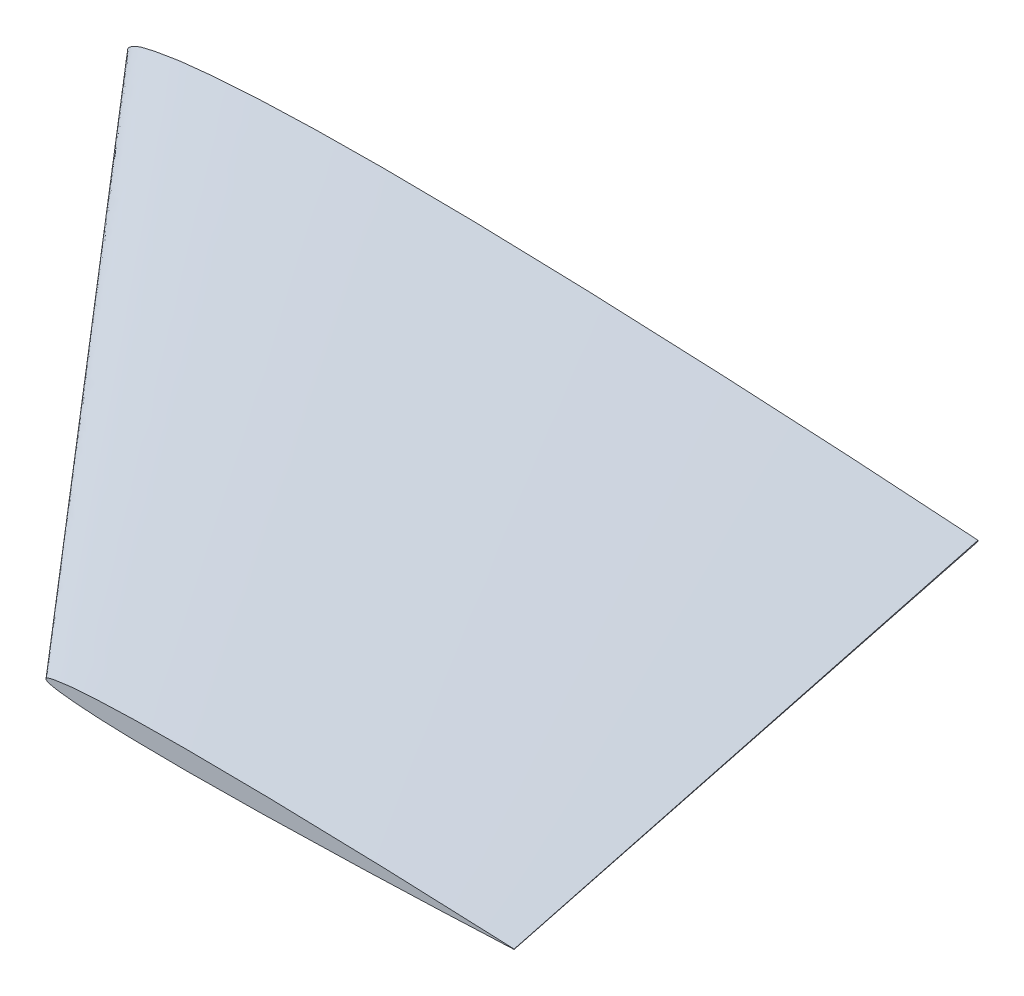
ISO-10303-21;
HEADER;
FILE_DESCRIPTION(('STEP AP214'),'2;1');
FILE_NAME('part.step','',(''),(''),'','','');
FILE_SCHEMA(('AUTOMOTIVE_DESIGN { 1 0 10303 214 1 1 1 1 }'));
ENDSEC;
DATA;
#1=APPLICATION_CONTEXT('core data for automotive mechanical design processes');
#2=APPLICATION_PROTOCOL_DEFINITION('international standard','automotive_design',2000,#1);
#3=PRODUCT_CONTEXT('',#1,'mechanical');
#4=PRODUCT('Part','Part','',(#3));
#5=PRODUCT_RELATED_PRODUCT_CATEGORY('part','',(#4));
#6=PRODUCT_DEFINITION_FORMATION('','',#4);
#7=PRODUCT_DEFINITION_CONTEXT('part definition',#1,'design');
#8=PRODUCT_DEFINITION('design','',#6,#7);
#9=PRODUCT_DEFINITION_SHAPE('','',#8);
#10=(LENGTH_UNIT() NAMED_UNIT(*) SI_UNIT(.MILLI.,.METRE.));
#11=(NAMED_UNIT(*) PLANE_ANGLE_UNIT() SI_UNIT($,.RADIAN.));
#12=(NAMED_UNIT(*) SI_UNIT($,.STERADIAN.) SOLID_ANGLE_UNIT());
#13=UNCERTAINTY_MEASURE_WITH_UNIT(LENGTH_MEASURE(1.E-05),#10,'distance_accuracy_value','');
#14=(GEOMETRIC_REPRESENTATION_CONTEXT(3) GLOBAL_UNCERTAINTY_ASSIGNED_CONTEXT((#13)) GLOBAL_UNIT_ASSIGNED_CONTEXT((#10,
#11,#12)) REPRESENTATION_CONTEXT('',''));
#15=CARTESIAN_POINT('',(0.,0.,0.));
#16=DIRECTION('',(0.,0.,1.));
#17=DIRECTION('',(1.,0.,0.));
#18=AXIS2_PLACEMENT_3D('',#15,#16,#17);
#19=CARTESIAN_POINT('',(55.2654777363227,0.405258247627,918.155140911372));
#20=DIRECTION('',(0.,0.,-1.));
#21=DIRECTION('',(-1.,0.,0.));
#22=AXIS2_PLACEMENT_3D('',#19,#20,#21);
#23=PLANE('',#22);
#24=CARTESIAN_POINT('',(1229.75838698594,0.898545269602727,918.155140911372));
#25=CARTESIAN_POINT('',(1224.34993136014,1.15130631630954,918.155140911372));
#26=CARTESIAN_POINT('',(1214.76939866025,1.59683717142616,918.155140911372));
#27=CARTESIAN_POINT('',(1199.86888525924,2.27524400613824,918.155140911372));
#28=CARTESIAN_POINT('',(1176.43264100726,3.33193433252579,918.155140911372));
#29=CARTESIAN_POINT('',(1139.11425082439,4.96070290179975,918.155140911372));
#30=CARTESIAN_POINT('',(1096.68051596079,6.72959467424628,918.155140911372));
#31=CARTESIAN_POINT('',(1056.90514291557,8.31684053019528,918.155140911372));
#32=CARTESIAN_POINT('',(1010.33634459829,10.118315015342,918.155140911372));
#33=CARTESIAN_POINT('',(960.789254243221,11.931625266129,918.155140911372));
#34=CARTESIAN_POINT('',(894.150492712139,14.2279822769853,918.155140911372));
#35=CARTESIAN_POINT('',(837.568975173821,16.0390334278064,918.155140911372));
#36=CARTESIAN_POINT('',(779.32132193488,17.7480230207474,918.155140911372));
#37=CARTESIAN_POINT('',(734.190270106455,18.9770111749645,918.155140911372));
#38=CARTESIAN_POINT('',(688.493528764218,20.1194114682806,918.155140911372));
#39=CARTESIAN_POINT('',(627.251826184914,21.4968016750588,918.155140911372));
#40=CARTESIAN_POINT('',(566.196309532538,22.6070292220859,918.155140911372));
#41=CARTESIAN_POINT('',(505.704852635155,23.3778785425328,918.155140911372));
#42=CARTESIAN_POINT('',(447.458734920324,23.8802464006073,918.155140911372));
#43=CARTESIAN_POINT('',(390.875359625353,23.9812870523486,918.155140911372));
#44=CARTESIAN_POINT('',(336.305763097462,23.5896145041729,918.155140911372));
#45=CARTESIAN_POINT('',(298.043986056536,23.0594518914088,918.155140911372));
#46=CARTESIAN_POINT('',(261.905755466201,22.2865017846476,918.155140911372));
#47=CARTESIAN_POINT('',(228.113855391048,21.2698584747062,918.155140911372));
#48=CARTESIAN_POINT('',(196.876279734094,20.0229760334591,918.155140911372));
#49=CARTESIAN_POINT('',(168.384950422636,18.5530382160247,918.155140911372));
#50=CARTESIAN_POINT('',(142.816057725576,16.8789210677314,918.155140911372));
#51=CARTESIAN_POINT('',(120.324058775331,15.0121491141771,918.155140911372));
#52=CARTESIAN_POINT('',(101.051103607294,13.0004806498629,918.155140911372));
#53=CARTESIAN_POINT('',(85.0971329000786,10.7977761238851,918.155140911372));
#54=CARTESIAN_POINT('',(72.5876254377587,8.62490914223578,918.155140911372));
#55=CARTESIAN_POINT('',(63.4611062545765,6.06034795633361,918.155140911372));
#56=CARTESIAN_POINT('',(57.7960656285395,4.14958959547926,918.155140911372));
#57=CARTESIAN_POINT('',(54.378337601271,0.405258247626857,918.155140911372));
#58=CARTESIAN_POINT('',(57.7960656285401,-3.33907310022474,918.155140911372));
#59=CARTESIAN_POINT('',(63.4611062545775,-5.24983146107839,918.155140911372));
#60=CARTESIAN_POINT('',(72.5876254377602,-7.81439264697905,918.155140911372));
#61=CARTESIAN_POINT('',(85.0971329000802,-9.98725962862657,918.155140911372));
#62=CARTESIAN_POINT('',(101.051103607296,-12.1899641546018,918.155140911372));
#63=CARTESIAN_POINT('',(120.324058775333,-14.2016326189131,918.155140911372));
#64=CARTESIAN_POINT('',(142.816057725579,-16.0684045724638,918.155140911372));
#65=CARTESIAN_POINT('',(168.384950422639,-17.7425217207532,918.155140911372));
#66=CARTESIAN_POINT('',(196.876279734098,-19.2124595381831,918.155140911372));
#67=CARTESIAN_POINT('',(228.113855391051,-20.4593419794254,918.155140911372));
#68=CARTESIAN_POINT('',(261.905755466204,-21.4759852893616,918.155140911372));
#69=CARTESIAN_POINT('',(298.04398605654,-22.2489353961172,918.155140911372));
#70=CARTESIAN_POINT('',(336.305763097466,-22.7790980088754,918.155140911372));
#71=CARTESIAN_POINT('',(390.875359625356,-23.1707705570427,918.155140911372));
#72=CARTESIAN_POINT('',(447.458734920328,-23.0697299052926,918.155140911372));
#73=CARTESIAN_POINT('',(505.704852635158,-22.5673620472091,918.155140911372));
#74=CARTESIAN_POINT('',(566.196309532541,-21.7965127267529,918.155140911372));
#75=CARTESIAN_POINT('',(627.251826184917,-20.6862851797162,918.155140911372));
#76=CARTESIAN_POINT('',(688.493528764221,-19.3088949729285,918.155140911372));
#77=CARTESIAN_POINT('',(734.190270106458,-18.1664946796054,918.155140911372));
#78=CARTESIAN_POINT('',(779.321321934882,-16.9375065253813,918.155140911372));
#79=CARTESIAN_POINT('',(863.764331051802,-14.4599436408096,918.155140911372));
#80=CARTESIAN_POINT('',(945.19610019987,-11.7216102378138,918.155140911372));
#81=CARTESIAN_POINT('',(1023.11508713161,-8.81346369795726,918.155140911372));
#82=CARTESIAN_POINT('',(1066.42142830851,-7.13819460159755,918.155140911372));
#83=CARTESIAN_POINT('',(1106.19593886475,-5.52895444030219,918.155140911372));
#84=CARTESIAN_POINT('',(1148.62859838091,-3.73493081305462,918.155140911372));
#85=CARTESIAN_POINT('',(1176.43264100726,-2.5214178370983,918.155140911372));
#86=CARTESIAN_POINT('',(1199.86888525924,-1.46472751070709,918.155140911372));
#87=CARTESIAN_POINT('',(1214.16606761279,-0.813789790322492,918.155140911372));
#88=CARTESIAN_POINT('',(1223.74663382607,-0.368984582325911,918.155140911372));
#89=CARTESIAN_POINT('',(1229.15508945187,-0.116223535618259,918.155140911372));
#90=CARTESIAN_POINT('',(1229.75838698594,-0.0880287741669511,918.155140911372));
#91=B_SPLINE_CURVE_WITH_KNOTS('',3,(#24,#25,#26,#27,#28,#29,#30,#31,#32,#33,#34,#35,#36,#37,#38,
#39,#40,#41,#42,#43,#44,#45,#46,#47,#48,#49,#50,#51,#52,#53,#54,#55,#56,#57,#58,#59,#60,#61,#62,
#63,#64,#65,#66,#67,#68,#69,#70,#71,#72,#73,#74,#75,#76,#77,#78,#79,#80,#81,#82,#83,#84,#85,#86,
#87,#88,#89,#90),.UNSPECIFIED.,.F.,.F.,(4,1,1,1,1,1,1,1,1,1,1,1,1,1,1,1,1,1,1,1,1,1,1,1,1,1,1,1,
1,1,1,1,1,1,1,1,1,1,1,1,1,1,1,1,1,1,1,1,1,1,1,1,1,1,1,1,1,1,1,1,1,1,1,1,4),(0.,
0.00689462452443807,0.0122129980770875,0.0189939135438821,0.036768569667984,0.0597793156848744,
0.0730757688774927,0.0874586832594532,0.119124190161914,0.136211022881369,0.17236657212777,
0.191211673140014,0.21041524145613,0.229857547050433,0.249419863694867,0.288419829497961,
0.307617824573225,0.326455527077329,0.362592745666242,0.379669911028139,0.39594558697329,
0.41131942363183,0.425698226139487,0.438994919331845,0.451128209388672,0.462026116437248,
0.471623197242087,0.479864509226328,0.48670418473288,0.492110985593961,0.496072413913456,
0.498623118658728,0.5,0.501376881341272,0.503927586086544,0.507889014406039,0.513295815267119,
0.520135490773672,0.528376802757913,0.537973883562752,0.548871790611328,0.561005080668155,
0.574301773860513,0.58868057636817,0.60405441302671,0.620330088971861,0.637407254333758,
0.673544472922671,0.692382175426775,0.711580170502039,0.750580136305133,0.770142452949567,
0.78958475854387,0.808788326859985,0.82763342787223,0.897160380173092,0.912541316740547,
0.926924231122507,0.95234774755356,0.963231430332016,0.981006086456118,0.987787001922912,
0.993105375475562,0.999230924636945,1.),.UNSPECIFIED.);
#92=CARTESIAN_POINT('',(1229.75838698594,0.898545269602727,918.155140911372));
#93=VERTEX_POINT('',#92);
#94=CARTESIAN_POINT('',(1229.75838698594,-0.0880287741669511,918.155140911372));
#95=VERTEX_POINT('',#94);
#96=EDGE_CURVE('E70',#93,#95,#91,.T.);
#97=ORIENTED_EDGE('',*,*,#96,.T.);
#98=DIRECTION('',(0.,1.,0.));
#99=VECTOR('',#98,1.);
#100=CARTESIAN_POINT('',(1229.75838698594,0.898545269602727,918.155140911372));
#101=LINE('',#100,#99);
#102=EDGE_CURVE('E12',#95,#93,#101,.T.);
#103=ORIENTED_EDGE('',*,*,#102,.T.);
#104=EDGE_LOOP('',(#97,#103));
#105=FACE_BOUND('',#104,.T.);
#106=ADVANCED_FACE('F60',(#105),#23,.F.);
#107=CARTESIAN_POINT('',(-1209.97458284238,-0.246171439116011,-551.844859088628));
#108=DIRECTION('',(0.,0.,-1.));
#109=DIRECTION('',(-1.,0.,0.));
#110=AXIS2_PLACEMENT_3D('',#107,#108,#109);
#111=PLANE('',#110);
#112=CARTESIAN_POINT('',(923.625417157617,1.09799656088432,-551.844859088628));
#113=CARTESIAN_POINT('',(888.06732232774,3.54460735318126,-551.844859088628));
#114=CARTESIAN_POINT('',(816.960024152842,8.43721715013834,-551.844859088628));
#115=CARTESIAN_POINT('',(674.732135806498,17.5357949323186,-551.844859088628));
#116=CARTESIAN_POINT('',(496.945434871093,27.9861196052224,-551.844859088628));
#117=CARTESIAN_POINT('',(283.58112304172,39.077632186636,-551.844859088628));
#118=CARTESIAN_POINT('',(70.2224980431571,48.74093153832,-551.844859088628));
#119=CARTESIAN_POINT('',(-143.138146072975,56.605070136845,-551.844859088628));
#120=CARTESIAN_POINT('',(-356.503590152205,62.2133345643726,-551.844859088628));
#121=CARTESIAN_POINT('',(-534.330553633457,64.1720758987067,-551.844859088628));
#122=CARTESIAN_POINT('',(-676.585573721354,63.397012287764,-551.844859088628));
#123=CARTESIAN_POINT('',(-783.278142447043,61.2911594275953,-551.844859088628));
#124=CARTESIAN_POINT('',(-890.02642619169,57.2331308576976,-551.844859088628));
#125=CARTESIAN_POINT('',(-978.872375952373,51.5926695171229,-551.844859088628));
#126=CARTESIAN_POINT('',(-1050.15080477563,44.7660884906984,-551.844859088628));
#127=CARTESIAN_POINT('',(-1103.12751739306,38.3296888009779,-551.844859088628));
#128=CARTESIAN_POINT('',(-1149.30191136656,29.46520616275,-551.844859088628));
#129=CARTESIAN_POINT('',(-1183.15092110764,21.6242292641085,-551.844859088628));
#130=CARTESIAN_POINT('',(-1224.63647939,-0.246171439115794,-551.844859088628));
#131=CARTESIAN_POINT('',(-1183.15092110764,-22.1165721423397,-551.844859088628));
#132=CARTESIAN_POINT('',(-1149.30191136656,-29.9575490409815,-551.844859088628));
#133=CARTESIAN_POINT('',(-1103.12751739306,-38.8220316792093,-551.844859088628));
#134=CARTESIAN_POINT('',(-1050.15080477563,-45.2584313689298,-551.844859088628));
#135=CARTESIAN_POINT('',(-978.872375952373,-52.0850123953543,-551.844859088628));
#136=CARTESIAN_POINT('',(-890.02642619169,-57.7254737359289,-551.844859088628));
#137=CARTESIAN_POINT('',(-783.278142447043,-61.7835023058266,-551.844859088628));
#138=CARTESIAN_POINT('',(-676.585573721354,-63.8893551659955,-551.844859088628));
#139=CARTESIAN_POINT('',(-534.330553633457,-64.6644187769381,-551.844859088628));
#140=CARTESIAN_POINT('',(-356.503590152204,-62.7056774426039,-551.844859088628));
#141=CARTESIAN_POINT('',(-143.138146072975,-57.0974130150764,-551.844859088628));
#142=CARTESIAN_POINT('',(70.2224980431576,-49.2332744165514,-551.844859088628));
#143=CARTESIAN_POINT('',(283.581123041721,-39.5699750648674,-551.844859088628));
#144=CARTESIAN_POINT('',(496.945434871091,-28.4784624834538,-551.844859088628));
#145=CARTESIAN_POINT('',(674.732135806499,-18.0281378105499,-551.844859088628));
#146=CARTESIAN_POINT('',(816.960024152842,-8.9295600283697,-551.844859088628));
#147=CARTESIAN_POINT('',(888.067322327741,-4.03695023141262,-551.844859088628));
#148=CARTESIAN_POINT('',(923.625417157617,-1.59033943911568,-551.844859088628));
#149=B_SPLINE_CURVE_WITH_KNOTS('',3,(#112,#113,#114,#115,#116,#117,#118,#119,#120,#121,#122,
#123,#124,#125,#126,#127,#128,#129,#130,#131,#132,#133,#134,#135,#136,#137,#138,#139,#140,#141,
#142,#143,#144,#145,#146,#147,#148),.UNSPECIFIED.,.F.,.F.,(4,1,1,1,1,1,1,1,1,1,1,1,1,1,1,1,1,1,
1,1,1,1,1,1,1,1,1,1,1,1,1,1,1,1,4),(0.,0.0249245577594703,0.0498428830048284,0.0996630479535091,
0.149464505803989,0.199249098798805,0.249016479528594,0.298766909273868,0.348503608962617,
0.373371187827416,0.398243492902326,0.423129722742987,0.448051612806012,0.46054281715137,
0.473079727808674,0.485731111482558,0.492200581361296,0.5,0.507799418638703,0.514268888517442,
0.526920272191325,0.53945718284863,0.551948387193988,0.576870277257013,0.601756507097674,
0.626628812172583,0.651496391037383,0.701233090726132,0.750983520471406,0.800750901201195,
0.850535494196011,0.900336952046491,0.950157116995171,0.97507544224053,1.),.UNSPECIFIED.);
#150=CARTESIAN_POINT('',(923.625417157617,1.09799656088432,-551.844859088628));
#151=VERTEX_POINT('',#150);
#152=CARTESIAN_POINT('',(923.625417157617,-1.59033943911568,-551.844859088628));
#153=VERTEX_POINT('',#152);
#154=EDGE_CURVE('E64',#151,#153,#149,.T.);
#155=ORIENTED_EDGE('',*,*,#154,.F.);
#156=DIRECTION('',(0.,1.,0.));
#157=VECTOR('',#156,1.);
#158=CARTESIAN_POINT('',(923.625417157617,1.09799656088432,-551.844859088628));
#159=LINE('',#158,#157);
#160=EDGE_CURVE('E97',#153,#151,#159,.T.);
#161=ORIENTED_EDGE('',*,*,#160,.F.);
#162=EDGE_LOOP('',(#155,#161));
#163=FACE_BOUND('',#162,.T.);
#164=ADVANCED_FACE('F105',(#163),#111,.T.);
#165=CARTESIAN_POINT('',(923.625417157617,1.09799656088432,-551.844859088628));
#166=CARTESIAN_POINT('',(1229.75838698594,0.898545269602727,918.155140911372));
#167=CARTESIAN_POINT('',(913.789346442854,1.77477738616962,-551.844859088628));
#168=CARTESIAN_POINT('',(1224.34993136014,1.15130631630954,918.155140911372));
#169=CARTESIAN_POINT('',(896.365930229293,2.97361321668103,-551.844859088628));
#170=CARTESIAN_POINT('',(1214.76939866025,1.59683717142616,918.155140911372));
#171=CARTESIAN_POINT('',(869.268073566488,4.82922714437675,-551.844859088628));
#172=CARTESIAN_POINT('',(1199.86888525924,2.27524400613824,918.155140911372));
#173=CARTESIAN_POINT('',(843.544505607081,6.57593733831357,-551.844859088628));
#174=CARTESIAN_POINT('',(1185.7243215897,2.91299224940928,918.155140911372));
#175=CARTESIAN_POINT('',(808.508526054949,8.9220676243081,-551.844859088628));
#176=CARTESIAN_POINT('',(1166.4597238693,3.7672042865263,918.155140911372));
#177=CARTESIAN_POINT('',(764.488058577073,11.7939446226889,-551.844859088628));
#178=CARTESIAN_POINT('',(1142.25671778818,4.81665356793921,918.155140911372));
#179=CARTESIAN_POINT('',(714.744728454747,14.9351792272061,-551.844859088628));
#180=CARTESIAN_POINT('',(1114.90951556066,5.96970098315827,918.155140911372));
#181=CARTESIAN_POINT('',(662.923388568366,18.1247945247199,-551.844859088628));
#182=CARTESIAN_POINT('',(1086.42140124516,7.13898712166777,918.155140911372));
#183=CARTESIAN_POINT('',(609.22903797123,21.3433431137826,-551.844859088628));
#184=CARTESIAN_POINT('',(1056.90514291557,8.31684053019528,918.155140911372));
#185=CARTESIAN_POINT('',(552.2909593488,24.6477615154637,-551.844859088628));
#186=CARTESIAN_POINT('',(1025.60778993394,9.52755209859143,918.155140911372));
#187=CARTESIAN_POINT('',(486.545356812237,28.3435433901783,-551.844859088628));
#188=CARTESIAN_POINT('',(989.471261540352,10.8819293612369,918.155140911372));
#189=CARTESIAN_POINT('',(416.930956707071,32.1064245543777,-551.844859088628));
#190=CARTESIAN_POINT('',(951.210830385022,12.261695637702,918.155140911372));
#191=CARTESIAN_POINT('',(345.809220326377,35.7744876363282,-551.844859088628));
#192=CARTESIAN_POINT('',(912.124857128222,13.6085896473173,918.155140911372));
#193=CARTESIAN_POINT('',(269.765620598856,39.5407174313364,-551.844859088628));
#194=CARTESIAN_POINT('',(870.336357016186,14.9902208971983,918.155140911372));
#195=CARTESIAN_POINT('',(191.201450692905,43.2408954505334,-551.844859088628));
#196=CARTESIAN_POINT('',(827.165465881324,16.3442730060948,918.155140911372));
#197=CARTESIAN_POINT('',(120.077937044886,46.3671733031927,-551.844859088628));
#198=CARTESIAN_POINT('',(788.086343897414,17.4908567576806,918.155140911372));
#199=CARTESIAN_POINT('',(65.7155603587633,48.637035099175,-551.844859088628));
#200=CARTESIAN_POINT('',(758.218240866912,18.3226924689272,918.155140911372));
#201=CARTESIAN_POINT('',(10.4961817065889,50.8528555495445,-551.844859088628));
#202=CARTESIAN_POINT('',(727.88043367474,19.1347545671329,918.155140911372));
#203=CARTESIAN_POINT('',(-60.6218662603444,53.5117378369311,-551.844859088628));
#204=CARTESIAN_POINT('',(688.810208285296,20.1114946066589,918.155140911372));
#205=CARTESIAN_POINT('',(-116.36732020811,55.3850943101544,-551.844859088628));
#206=CARTESIAN_POINT('',(658.187548044737,20.8010248018708,918.155140911372));
#207=CARTESIAN_POINT('',(-200.070255091131,58.0239917181841,-551.844859088628));
#208=CARTESIAN_POINT('',(612.208689017363,21.7703446109447,918.155140911372));
#209=CARTESIAN_POINT('',(-271.188090215329,59.9673465033982,-551.844859088628));
#210=CARTESIAN_POINT('',(573.145837281976,22.4806596887613,918.155140911372));
#211=CARTESIAN_POINT('',(-354.394992056531,61.6510999032166,-551.844859088628));
#212=CARTESIAN_POINT('',(527.44705302474,23.1008152801326,918.155140911372));
#213=CARTESIAN_POINT('',(-408.778816513714,62.5913472272243,-551.844859088628));
#214=CARTESIAN_POINT('',(497.579552218694,23.447958574071,918.155140911372));
#215=CARTESIAN_POINT('',(-479.898172972523,63.4951728859228,-551.844859088628));
#216=CARTESIAN_POINT('',(458.522578130665,23.7848216850432,918.155140911372));
#217=CARTESIAN_POINT('',(-558.512954247965,63.8807463623216,-551.844859088628));
#218=CARTESIAN_POINT('',(415.350633737413,23.9375816771401,918.155140911372));
#219=CARTESIAN_POINT('',(-625.603748861349,63.6747821495519,-551.844859088628));
#220=CARTESIAN_POINT('',(378.507697931058,23.8665518363043,918.155140911372));
#221=CARTESIAN_POINT('',(-670.169653906873,63.2516192473587,-551.844859088628));
#222=CARTESIAN_POINT('',(354.033130941068,23.7168524494306,918.155140911372));
#223=CARTESIAN_POINT('',(-717.858278201574,62.564855246702,-551.844859088628));
#224=CARTESIAN_POINT('',(327.842178711294,23.4723414353679,918.155140911372));
#225=CARTESIAN_POINT('',(-753.41753689877,61.805878789219,-551.844859088628));
#226=CARTESIAN_POINT('',(308.311633412431,23.2017224070547,918.155140911372));
#227=CARTESIAN_POINT('',(-798.662464187911,60.5377224375339,-551.844859088628));
#228=CARTESIAN_POINT('',(283.461301831965,22.7475470985034,918.155140911372));
#229=CARTESIAN_POINT('',(-837.521393532175,59.2291060164683,-551.844859088628));
#230=CARTESIAN_POINT('',(262.118572647569,22.2767211279415,918.155140911372));
#231=CARTESIAN_POINT('',(-876.741529253904,57.4763437707698,-551.844859088628));
#232=CARTESIAN_POINT('',(240.56736183194,21.6445273740663,918.155140911372));
#233=CARTESIAN_POINT('',(-916.250771619602,55.4202728230343,-551.844859088628));
#234=CARTESIAN_POINT('',(218.846425978117,20.8999387620697,918.155140911372));
#235=CARTESIAN_POINT('',(-951.806552265554,53.260783138629,-551.844859088628));
#236=CARTESIAN_POINT('',(199.290455818334,20.1193405465882,918.155140911372));
#237=CARTESIAN_POINT('',(-988.082115093888,50.4609469450632,-551.844859088628));
#238=CARTESIAN_POINT('',(179.344909331845,19.1184894767244,918.155140911372));
#239=CARTESIAN_POINT('',(-1018.8260883676,47.7661646458485,-551.844859088628));
#240=CARTESIAN_POINT('',(162.450696158399,18.1546953146969,918.155140911372));
#241=CARTESIAN_POINT('',(-1038.73154448351,45.7976272294449,-551.844859088628));
#242=CARTESIAN_POINT('',(151.499110210343,17.4474418572903,918.155140911372));
#243=CARTESIAN_POINT('',(-1067.73733768746,42.6058037198232,-551.844859088628));
#244=CARTESIAN_POINT('',(135.447212428448,16.2673278624681,918.155140911372));
#245=CARTESIAN_POINT('',(-1085.41183064038,40.414974206502,-551.844859088628));
#246=CARTESIAN_POINT('',(125.634530108997,15.452903133763,918.155140911372));
#247=CARTESIAN_POINT('',(-1110.90479321826,36.51099551613,-551.844859088628));
#248=CARTESIAN_POINT('',(111.691464284776,14.1110979805834,918.155140911372));
#249=CARTESIAN_POINT('',(-1131.30914816735,32.9194266357823,-551.844859088628));
#250=CARTESIAN_POINT('',(100.676626719884,12.92564924701,918.155140911372));
#251=CARTESIAN_POINT('',(-1150.20854097809,29.0500249577539,-551.844859088628));
#252=CARTESIAN_POINT('',(90.0651813268249,11.4836958209748,918.155140911372));
#253=CARTESIAN_POINT('',(-1166.3151929633,25.5226628781397,-551.844859088628));
#254=CARTESIAN_POINT('',(80.5692000105757,10.0112866557458,918.155140911372));
#255=CARTESIAN_POINT('',(-1174.72578772203,23.3341592986884,-551.844859088628));
#256=CARTESIAN_POINT('',(75.5759647165899,9.14397544188799,918.155140911372));
#257=CARTESIAN_POINT('',(-1189.11263831586,17.6743977131648,-551.844859088628));
#258=CARTESIAN_POINT('',(68.3789462404663,7.44226600122543,918.155140911372));
#259=CARTESIAN_POINT('',(-1200.23879135985,12.4749934791344,-551.844859088628));
#260=CARTESIAN_POINT('',(63.3967682225039,6.03864741774638,918.155140911372));
#261=CARTESIAN_POINT('',(-1208.67115223669,5.01072603574235,-551.844859088628));
#262=CARTESIAN_POINT('',(57.7960656285395,4.14958959547926,918.155140911372));
#263=CARTESIAN_POINT('',(-1210.43152235716,-0.246171439116067,-551.844859088628));
#264=CARTESIAN_POINT('',(54.378337601271,0.405258247626857,918.155140911372));
#265=CARTESIAN_POINT('',(-1208.67115223669,-5.50306891397447,-551.844859088628));
#266=CARTESIAN_POINT('',(57.7960656285401,-3.33907310022474,918.155140911372));
#267=CARTESIAN_POINT('',(-1200.23879135985,-12.9673363573664,-551.844859088628));
#268=CARTESIAN_POINT('',(63.3967682225047,-5.2281309224911,918.155140911372));
#269=CARTESIAN_POINT('',(-1189.11263831586,-18.1667405913966,-551.844859088628));
#270=CARTESIAN_POINT('',(68.3789462404674,-6.63174950596933,918.155140911372));
#271=CARTESIAN_POINT('',(-1174.72578772203,-23.82650217692,-551.844859088628));
#272=CARTESIAN_POINT('',(75.575964716591,-8.33345894663077,918.155140911372));
#273=CARTESIAN_POINT('',(-1166.3151929633,-26.0150057563712,-551.844859088628));
#274=CARTESIAN_POINT('',(80.5692000105769,-9.20077016048784,918.155140911372));
#275=CARTESIAN_POINT('',(-1150.20854097809,-29.5423678359855,-551.844859088628));
#276=CARTESIAN_POINT('',(90.0651813268264,-10.6731793257154,918.155140911372));
#277=CARTESIAN_POINT('',(-1131.30914816735,-33.4117695140138,-551.844859088628));
#278=CARTESIAN_POINT('',(100.676626719886,-12.1151327517489,918.155140911372));
#279=CARTESIAN_POINT('',(-1110.90479321826,-37.0033383943615,-551.844859088628));
#280=CARTESIAN_POINT('',(111.691464284779,-13.3005814853206,918.155140911372));
#281=CARTESIAN_POINT('',(-1085.41183064037,-40.9073170847335,-551.844859088628));
#282=CARTESIAN_POINT('',(125.634530108999,-14.6423866384981,918.155140911372));
#283=CARTESIAN_POINT('',(-1067.73733768746,-43.0981465980547,-551.844859088628));
#284=CARTESIAN_POINT('',(135.44721242845,-15.4568113672016,918.155140911372));
#285=CARTESIAN_POINT('',(-1038.73154448351,-46.2899701076764,-551.844859088628));
#286=CARTESIAN_POINT('',(151.499110210345,-16.6369253620213,918.155140911372));
#287=CARTESIAN_POINT('',(-1018.8260883676,-48.2585075240799,-551.844859088628));
#288=CARTESIAN_POINT('',(162.450696158401,-17.3441788194263,918.155140911372));
#289=CARTESIAN_POINT('',(-988.082115093887,-50.9532898232946,-551.844859088628));
#290=CARTESIAN_POINT('',(179.344909331848,-18.3079729814511,918.155140911372));
#291=CARTESIAN_POINT('',(-951.806552265553,-53.7531260168604,-551.844859088628));
#292=CARTESIAN_POINT('',(199.290455818337,-19.3088240513119,918.155140911372));
#293=CARTESIAN_POINT('',(-916.250771619601,-55.9126157012658,-551.844859088628));
#294=CARTESIAN_POINT('',(218.846425978121,-20.0894222667904,918.155140911372));
#295=CARTESIAN_POINT('',(-876.741529253903,-57.9686866490012,-551.844859088628));
#296=CARTESIAN_POINT('',(240.567361831943,-20.8340108787836,918.155140911372));
#297=CARTESIAN_POINT('',(-837.521393532175,-59.7214488946996,-551.844859088628));
#298=CARTESIAN_POINT('',(262.118572647571,-21.4662046326554,918.155140911372));
#299=CARTESIAN_POINT('',(-798.66246418791,-61.0300653157653,-551.844859088628));
#300=CARTESIAN_POINT('',(283.461301831968,-21.937030603214,918.155140911372));
#301=CARTESIAN_POINT('',(-753.417536898768,-62.2982216674504,-551.844859088628));
#302=CARTESIAN_POINT('',(308.311633412433,-22.3912059117615,918.155140911372));
#303=CARTESIAN_POINT('',(-717.858278201572,-63.0571981249334,-551.844859088628));
#304=CARTESIAN_POINT('',(327.842178711298,-22.6618249400717,918.155140911372));
#305=CARTESIAN_POINT('',(-670.169653906872,-63.7439621255901,-551.844859088628));
#306=CARTESIAN_POINT('',(354.033130941071,-22.9063359541304,918.155140911372));
#307=CARTESIAN_POINT('',(-625.603748861348,-64.1671250277833,-551.844859088628));
#308=CARTESIAN_POINT('',(378.507697931061,-23.0560353410003,918.155140911372));
#309=CARTESIAN_POINT('',(-558.512954247964,-64.3730892405529,-551.844859088628));
#310=CARTESIAN_POINT('',(415.350633737417,-23.1270651818304,918.155140911372));
#311=CARTESIAN_POINT('',(-479.898172972522,-63.9875157641542,-551.844859088628));
#312=CARTESIAN_POINT('',(458.522578130669,-22.9743051897268,918.155140911372));
#313=CARTESIAN_POINT('',(-408.778816513714,-63.0836901054557,-551.844859088628));
#314=CARTESIAN_POINT('',(497.579552218697,-22.6374420787485,918.155140911372));
#315=CARTESIAN_POINT('',(-354.39499205653,-62.1434427814479,-551.844859088628));
#316=CARTESIAN_POINT('',(527.447053024744,-22.2902987848055,918.155140911372));
#317=CARTESIAN_POINT('',(-271.188090215329,-60.4596893816296,-551.844859088628));
#318=CARTESIAN_POINT('',(573.145837281979,-21.6701431934272,918.155140911372));
#319=CARTESIAN_POINT('',(-200.07025509113,-58.5163345964155,-551.844859088628));
#320=CARTESIAN_POINT('',(612.208689017367,-20.9598281156045,918.155140911372));
#321=CARTESIAN_POINT('',(-116.367320208109,-55.8774371883858,-551.844859088628));
#322=CARTESIAN_POINT('',(658.18754804474,-19.9905083065235,918.155140911372));
#323=CARTESIAN_POINT('',(-60.6218662603435,-54.0040807151625,-551.844859088628));
#324=CARTESIAN_POINT('',(688.810208285298,-19.3009781113069,918.155140911372));
#325=CARTESIAN_POINT('',(10.4961817065896,-51.3451984277758,-551.844859088628));
#326=CARTESIAN_POINT('',(727.880433674743,-18.3242380717748,918.155140911372));
#327=CARTESIAN_POINT('',(65.7155603587641,-49.1293779774064,-551.844859088628));
#328=CARTESIAN_POINT('',(758.218240866914,-17.5121759735645,918.155140911372));
#329=CARTESIAN_POINT('',(120.077937044887,-46.8595161814241,-551.844859088628));
#330=CARTESIAN_POINT('',(788.086343897416,-16.6803402623132,918.155140911372));
#331=CARTESIAN_POINT('',(191.201450692906,-43.7332383287647,-551.844859088628));
#332=CARTESIAN_POINT('',(827.165465881326,-15.5337565107213,918.155140911372));
#333=CARTESIAN_POINT('',(317.434085739566,-37.7879935426986,-551.844859088628));
#334=CARTESIAN_POINT('',(896.530092279565,-13.3581184025366,918.155140911372));
#335=CARTESIAN_POINT('',(421.261754502412,-32.4127966081231,-551.844859088628));
#336=CARTESIAN_POINT('',(953.590228707229,-11.3824694013664,918.155140911372));
#337=CARTESIAN_POINT('',(509.795641162077,-27.5289094339619,-551.844859088628));
#338=CARTESIAN_POINT('',(1002.2505782037,-9.5921833891881,918.155140911372));
#339=CARTESIAN_POINT('',(552.2909593488,-25.1401043936951,-551.844859088628));
#340=CARTESIAN_POINT('',(1025.60778993394,-8.71703560318726,918.155140911372));
#341=CARTESIAN_POINT('',(623.414304820187,-21.0124397929407,-551.844859088628));
#342=CARTESIAN_POINT('',(1064.70240819834,-7.20469343729502,918.155140911372));
#343=CARTESIAN_POINT('',(680.233363437403,-17.5676920541617,-551.844859088628));
#344=CARTESIAN_POINT('',(1095.93704660771,-5.94401979747572,918.155140911372));
#345=CARTESIAN_POINT('',(732.051992828088,-14.3345880854317,-551.844859088628));
#346=CARTESIAN_POINT('',(1124.42447650887,-4.75826442000619,918.155140911372));
#347=CARTESIAN_POINT('',(767.614016524345,-12.0823513039412,-551.844859088628));
#348=CARTESIAN_POINT('',(1143.97541100116,-3.93166437150842,918.155140911372));
#349=CARTESIAN_POINT('',(808.50852605495,-9.41441050253943,-551.844859088628));
#350=CARTESIAN_POINT('',(1166.4597238693,-2.95668779110035,918.155140911372));
#351=CARTESIAN_POINT('',(843.544505607081,-7.0682802165449,-551.844859088628));
#352=CARTESIAN_POINT('',(1185.7243215897,-2.10247575398035,918.155140911372));
#353=CARTESIAN_POINT('',(869.268073566489,-5.32157002260807,-551.844859088628));
#354=CARTESIAN_POINT('',(1199.86888525924,-1.46472751070709,918.155140911372));
#355=CARTESIAN_POINT('',(895.268721173203,-3.54109105600584,-551.844859088628));
#356=CARTESIAN_POINT('',(1214.16606761279,-0.813789790322492,918.155140911372));
#357=CARTESIAN_POINT('',(912.692161290975,-2.3426132019888,-551.844859088628));
#358=CARTESIAN_POINT('',(1223.74663382607,-0.368984582325911,918.155140911372));
#359=CARTESIAN_POINT('',(922.528232005739,-1.66583237670351,-551.844859088628));
#360=CARTESIAN_POINT('',(1229.15508945187,-0.116223535618259,918.155140911372));
#361=CARTESIAN_POINT('',(923.625417157617,-1.59033943911568,-551.844859088628));
#362=CARTESIAN_POINT('',(1229.75838698594,-0.0880287741669511,918.155140911372));
#363=B_SPLINE_SURFACE_WITH_KNOTS('',3,1,((#165,#166),(#167,#168),(#169,#170),(#171,#172),(#173,
#174),(#175,#176),(#177,#178),(#179,#180),(#181,#182),(#183,#184),(#185,#186),(#187,#188),(#189,
#190),(#191,#192),(#193,#194),(#195,#196),(#197,#198),(#199,#200),(#201,#202),(#203,#204),(#205,
#206),(#207,#208),(#209,#210),(#211,#212),(#213,#214),(#215,#216),(#217,#218),(#219,#220),(#221,
#222),(#223,#224),(#225,#226),(#227,#228),(#229,#230),(#231,#232),(#233,#234),(#235,#236),(#237,
#238),(#239,#240),(#241,#242),(#243,#244),(#245,#246),(#247,#248),(#249,#250),(#251,#252),(#253,
#254),(#255,#256),(#257,#258),(#259,#260),(#261,#262),(#263,#264),(#265,#266),(#267,#268),(#269,
#270),(#271,#272),(#273,#274),(#275,#276),(#277,#278),(#279,#280),(#281,#282),(#283,#284),(#285,
#286),(#287,#288),(#289,#290),(#291,#292),(#293,#294),(#295,#296),(#297,#298),(#299,#300),(#301,
#302),(#303,#304),(#305,#306),(#307,#308),(#309,#310),(#311,#312),(#313,#314),(#315,#316),(#317,
#318),(#319,#320),(#321,#322),(#323,#324),(#325,#326),(#327,#328),(#329,#330),(#331,#332),(#333,
#334),(#335,#336),(#337,#338),(#339,#340),(#341,#342),(#343,#344),(#345,#346),(#347,#348),(#349,
#350),(#351,#352),(#353,#354),(#355,#356),(#357,#358),(#359,#360),(#361,#362)),.UNSPECIFIED.,
.F.,.F.,.F.,(4,1,1,1,1,1,1,1,1,1,1,1,1,1,1,1,1,1,1,1,1,1,1,1,1,1,1,1,1,1,1,1,1,1,1,1,1,1,1,1,1,
1,1,1,1,1,1,1,1,1,1,1,1,1,1,1,1,1,1,1,1,1,1,1,1,1,1,1,1,1,1,1,1,1,1,1,1,1,1,1,1,1,1,1,1,1,1,1,1,
1,1,1,1,1,1,1,4),(2,2),(0.,0.00689462452443808,0.0122129980770875,0.0189939135438821,
0.0249245577594703,0.036768569667984,0.0498428830048284,0.0597793156848744,0.0730757688774927,
0.0874586832594532,0.0996630479535091,0.119124190161914,0.136211022881369,0.149464505803989,
0.17236657212777,0.191211673140014,0.199249098798805,0.21041524145613,0.229857547050433,
0.249016479528594,0.249419863694867,0.288419829497961,0.298766909273868,0.307617824573225,
0.326455527077329,0.348503608962617,0.362592745666242,0.373371187827416,0.379669911028139,
0.39594558697329,0.398243492902326,0.41131942363183,0.423129722742987,0.425698226139487,
0.438994919331845,0.448051612806012,0.451128209388672,0.46054281715137,0.462026116437248,
0.471623197242087,0.473079727808674,0.479864509226328,0.485731111482558,0.486704184732881,
0.492110985593961,0.492200581361296,0.496072413913456,0.498623118658728,0.5,0.501376881341272,
0.503927586086544,0.507799418638703,0.507889014406039,0.51329581526712,0.514268888517442,
0.520135490773672,0.526920272191325,0.528376802757913,0.537973883562752,0.53945718284863,
0.548871790611328,0.551948387193988,0.561005080668155,0.574301773860513,0.576870277257013,
0.58868057636817,0.601756507097674,0.60405441302671,0.620330088971861,0.626628812172583,
0.637407254333759,0.651496391037383,0.673544472922671,0.692382175426775,0.701233090726132,
0.711580170502039,0.750580136305133,0.750983520471406,0.770142452949567,0.78958475854387,
0.800750901201195,0.808788326859986,0.82763342787223,0.850535494196011,0.897160380173092,
0.900336952046491,0.912541316740547,0.926924231122507,0.950157116995171,0.95234774755356,
0.963231430332016,0.97507544224053,0.981006086456118,0.987787001922913,0.993105375475562,
0.999230924636945,1.),(0.,1.),.UNSPECIFIED.);
#364=DIRECTION('',(0.203879453395807,0.00100051385308875,0.978995488986061));
#365=VECTOR('',#364,1.);
#366=CARTESIAN_POINT('',(1076.69190207178,-0.839184106641316,183.155140911372));
#367=LINE('',#366,#365);
#368=EDGE_CURVE('E78',#153,#95,#367,.T.);
#369=DIRECTION('',(-0.20387955364176,0.00013283129962306,-0.978995970350584));
#370=VECTOR('',#369,1.);
#371=CARTESIAN_POINT('',(1076.69190207178,0.998270915243522,183.155140911372));
#372=LINE('',#371,#370);
#373=EDGE_CURVE('E90',#93,#151,#372,.T.);
#374=ORIENTED_EDGE('',*,*,#154,.T.);
#375=ORIENTED_EDGE('',*,*,#368,.T.);
#376=ORIENTED_EDGE('',*,*,#96,.F.);
#377=ORIENTED_EDGE('',*,*,#373,.T.);
#378=EDGE_LOOP('',(#374,#375,#376,#377));
#379=FACE_BOUND('',#378,.T.);
#380=ADVANCED_FACE('F92',(#379),#363,.T.);
#381=CARTESIAN_POINT('',(834.938336654755,-0.246171439115682,-977.705583636906));
#382=DIRECTION('',(-0.978995978987362,0.,0.203879555440401));
#383=DIRECTION('',(0.203879555440401,0.,0.978995978987363));
#384=AXIS2_PLACEMENT_3D('',#381,#382,#383);
#385=PLANE('',#384);
#386=ORIENTED_EDGE('',*,*,#373,.F.);
#387=ORIENTED_EDGE('',*,*,#102,.F.);
#388=ORIENTED_EDGE('',*,*,#368,.F.);
#389=ORIENTED_EDGE('',*,*,#160,.T.);
#390=EDGE_LOOP('',(#386,#387,#388,#389));
#391=FACE_BOUND('',#390,.T.);
#392=ADVANCED_FACE('F100',(#391),#385,.F.);
#393=CLOSED_SHELL('',(#106,#164,#380,#392));
#394=MANIFOLD_SOLID_BREP('B2',#393);
#395=ADVANCED_BREP_SHAPE_REPRESENTATION('',(#18,#394),#14);
#396=SHAPE_DEFINITION_REPRESENTATION(#9,#395);
ENDSEC;
END-ISO-10303-21;
